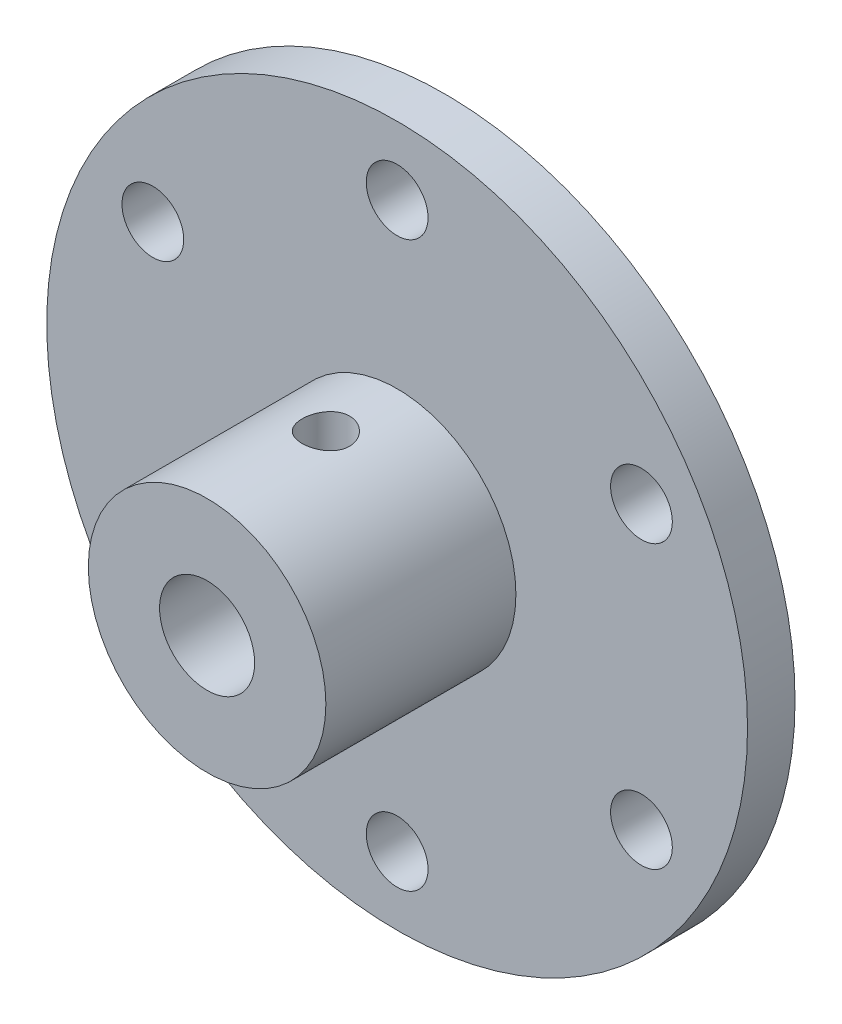
ISO-10303-21;
HEADER;
FILE_DESCRIPTION(('STEP AP214'),'2;1');
FILE_NAME('part.step','',(''),(''),'','','');
FILE_SCHEMA(('AUTOMOTIVE_DESIGN { 1 0 10303 214 1 1 1 1 }'));
ENDSEC;
DATA;
#1=APPLICATION_CONTEXT('core data for automotive mechanical design processes');
#2=APPLICATION_PROTOCOL_DEFINITION('international standard','automotive_design',2000,#1);
#3=PRODUCT_CONTEXT('',#1,'mechanical');
#4=PRODUCT('Part','Part','',(#3));
#5=PRODUCT_RELATED_PRODUCT_CATEGORY('part','',(#4));
#6=PRODUCT_DEFINITION_FORMATION('','',#4);
#7=PRODUCT_DEFINITION_CONTEXT('part definition',#1,'design');
#8=PRODUCT_DEFINITION('design','',#6,#7);
#9=PRODUCT_DEFINITION_SHAPE('','',#8);
#10=(LENGTH_UNIT() NAMED_UNIT(*) SI_UNIT(.MILLI.,.METRE.));
#11=(NAMED_UNIT(*) PLANE_ANGLE_UNIT() SI_UNIT($,.RADIAN.));
#12=(NAMED_UNIT(*) SI_UNIT($,.STERADIAN.) SOLID_ANGLE_UNIT());
#13=UNCERTAINTY_MEASURE_WITH_UNIT(LENGTH_MEASURE(1.E-05),#10,'distance_accuracy_value','');
#14=(GEOMETRIC_REPRESENTATION_CONTEXT(3) GLOBAL_UNCERTAINTY_ASSIGNED_CONTEXT((#13)) GLOBAL_UNIT_ASSIGNED_CONTEXT((#10,
#11,#12)) REPRESENTATION_CONTEXT('',''));
#15=CARTESIAN_POINT('',(0.,0.,0.));
#16=DIRECTION('',(0.,0.,1.));
#17=DIRECTION('',(1.,0.,0.));
#18=AXIS2_PLACEMENT_3D('',#15,#16,#17);
#19=CARTESIAN_POINT('',(0.,0.,4.));
#20=DIRECTION('',(0.,0.,-1.));
#21=DIRECTION('',(-1.,0.,0.));
#22=AXIS2_PLACEMENT_3D('',#19,#20,#21);
#23=CYLINDRICAL_SURFACE('',#22,29.5);
#24=CARTESIAN_POINT('',(0.,0.,4.));
#25=DIRECTION('',(0.,0.,1.));
#26=DIRECTION('',(1.,0.,0.));
#27=AXIS2_PLACEMENT_3D('',#24,#25,#26);
#28=CIRCLE('',#27,29.5);
#29=CARTESIAN_POINT('',(29.5,0.,4.));
#30=VERTEX_POINT('',#29);
#31=EDGE_CURVE('E47',#30,#30,#28,.T.);
#32=ORIENTED_EDGE('',*,*,#31,.F.);
#33=EDGE_LOOP('',(#32));
#34=FACE_BOUND('',#33,.T.);
#35=CARTESIAN_POINT('',(0.,0.,0.));
#36=DIRECTION('',(0.,0.,1.));
#37=DIRECTION('',(1.,0.,0.));
#38=AXIS2_PLACEMENT_3D('',#35,#36,#37);
#39=CIRCLE('',#38,29.5);
#40=CARTESIAN_POINT('',(29.5,0.,0.));
#41=VERTEX_POINT('',#40);
#42=EDGE_CURVE('E52',#41,#41,#39,.T.);
#43=ORIENTED_EDGE('',*,*,#42,.T.);
#44=EDGE_LOOP('',(#43));
#45=FACE_BOUND('',#44,.T.);
#46=ADVANCED_FACE('F35',(#34,#45),#23,.T.);
#47=CARTESIAN_POINT('',(0.,0.,4.));
#48=DIRECTION('',(0.,0.,1.));
#49=DIRECTION('',(1.,0.,0.));
#50=AXIS2_PLACEMENT_3D('',#47,#48,#49);
#51=PLANE('',#50);
#52=CARTESIAN_POINT('',(0.,23.75,4.));
#53=DIRECTION('',(0.,0.,1.));
#54=DIRECTION('',(1.,0.,0.));
#55=AXIS2_PLACEMENT_3D('',#52,#53,#54);
#56=CIRCLE('',#55,2.6);
#57=CARTESIAN_POINT('',(2.6,23.75,4.));
#58=VERTEX_POINT('',#57);
#59=EDGE_CURVE('E289',#58,#58,#56,.T.);
#60=ORIENTED_EDGE('',*,*,#59,.F.);
#61=EDGE_LOOP('',(#60));
#62=FACE_BOUND('',#61,.T.);
#63=CARTESIAN_POINT('',(-20.5681033398799,11.8749999999991,4.));
#64=DIRECTION('',(0.,0.,1.));
#65=DIRECTION('',(1.,0.,0.));
#66=AXIS2_PLACEMENT_3D('',#63,#64,#65);
#67=CIRCLE('',#66,2.60000000000102);
#68=CARTESIAN_POINT('',(-17.9681033398789,11.8749999999991,4.));
#69=VERTEX_POINT('',#68);
#70=EDGE_CURVE('E294',#69,#69,#67,.T.);
#71=ORIENTED_EDGE('',*,*,#70,.F.);
#72=EDGE_LOOP('',(#71));
#73=FACE_BOUND('',#72,.T.);
#74=CARTESIAN_POINT('',(-20.5681033398789,-11.8750000000009,4.));
#75=DIRECTION('',(0.,0.,1.));
#76=DIRECTION('',(1.,0.,0.));
#77=AXIS2_PLACEMENT_3D('',#74,#75,#76);
#78=CIRCLE('',#77,2.60000000000192);
#79=CARTESIAN_POINT('',(-17.968103339877,-11.8750000000009,4.));
#80=VERTEX_POINT('',#79);
#81=EDGE_CURVE('E270',#80,#80,#78,.T.);
#82=ORIENTED_EDGE('',*,*,#81,.F.);
#83=EDGE_LOOP('',(#82));
#84=FACE_BOUND('',#83,.T.);
#85=CARTESIAN_POINT('',(2.01632118847236E-12,-23.75,4.));
#86=DIRECTION('',(0.,0.,1.));
#87=DIRECTION('',(1.,0.,0.));
#88=AXIS2_PLACEMENT_3D('',#85,#86,#87);
#89=CIRCLE('',#88,2.60000000000209);
#90=CARTESIAN_POINT('',(2.6000000000041,-23.75,4.));
#91=VERTEX_POINT('',#90);
#92=EDGE_CURVE('E269',#91,#91,#89,.T.);
#93=ORIENTED_EDGE('',*,*,#92,.F.);
#94=EDGE_LOOP('',(#93));
#95=FACE_BOUND('',#94,.T.);
#96=CARTESIAN_POINT('',(20.5681033398819,-11.8749999999991,4.));
#97=DIRECTION('',(0.,0.,1.));
#98=DIRECTION('',(1.,0.,0.));
#99=AXIS2_PLACEMENT_3D('',#96,#97,#98);
#100=CIRCLE('',#99,2.6000000000013);
#101=CARTESIAN_POINT('',(23.1681033398832,-11.8749999999991,4.));
#102=VERTEX_POINT('',#101);
#103=EDGE_CURVE('E277',#102,#102,#100,.T.);
#104=ORIENTED_EDGE('',*,*,#103,.F.);
#105=EDGE_LOOP('',(#104));
#106=FACE_BOUND('',#105,.T.);
#107=CARTESIAN_POINT('',(20.5681033398809,11.8750000000009,4.));
#108=DIRECTION('',(0.,0.,1.));
#109=DIRECTION('',(1.,0.,0.));
#110=AXIS2_PLACEMENT_3D('',#107,#108,#109);
#111=CIRCLE('',#110,2.60000000000029);
#112=CARTESIAN_POINT('',(23.1681033398812,11.8750000000009,4.));
#113=VERTEX_POINT('',#112);
#114=EDGE_CURVE('E283',#113,#113,#111,.T.);
#115=ORIENTED_EDGE('',*,*,#114,.F.);
#116=EDGE_LOOP('',(#115));
#117=FACE_BOUND('',#116,.T.);
#118=CARTESIAN_POINT('',(0.,0.,4.));
#119=DIRECTION('',(0.,0.,1.));
#120=DIRECTION('',(1.,0.,0.));
#121=AXIS2_PLACEMENT_3D('',#118,#119,#120);
#122=CIRCLE('',#121,10.);
#123=CARTESIAN_POINT('',(10.,0.,4.));
#124=VERTEX_POINT('',#123);
#125=EDGE_CURVE('E10',#124,#124,#122,.T.);
#126=ORIENTED_EDGE('',*,*,#125,.F.);
#127=EDGE_LOOP('',(#126));
#128=FACE_BOUND('',#127,.T.);
#129=ORIENTED_EDGE('',*,*,#31,.T.);
#130=EDGE_LOOP('',(#129));
#131=FACE_BOUND('',#130,.T.);
#132=ADVANCED_FACE('F99',(#62,#73,#84,#95,#106,#117,#128,#131),#51,.T.);
#133=CARTESIAN_POINT('',(0.,0.,0.));
#134=DIRECTION('',(0.,0.,1.));
#135=DIRECTION('',(1.,0.,0.));
#136=AXIS2_PLACEMENT_3D('',#133,#134,#135);
#137=PLANE('',#136);
#138=CARTESIAN_POINT('',(0.,23.75,0.));
#139=DIRECTION('',(0.,0.,1.));
#140=DIRECTION('',(1.,0.,0.));
#141=AXIS2_PLACEMENT_3D('',#138,#139,#140);
#142=CIRCLE('',#141,2.6);
#143=CARTESIAN_POINT('',(2.6,23.75,0.));
#144=VERTEX_POINT('',#143);
#145=EDGE_CURVE('E263',#144,#144,#142,.F.);
#146=ORIENTED_EDGE('',*,*,#145,.F.);
#147=EDGE_LOOP('',(#146));
#148=FACE_BOUND('',#147,.T.);
#149=CARTESIAN_POINT('',(-20.5681033398799,11.8749999999991,0.));
#150=DIRECTION('',(0.,0.,1.));
#151=DIRECTION('',(1.,0.,0.));
#152=AXIS2_PLACEMENT_3D('',#149,#150,#151);
#153=CIRCLE('',#152,2.60000000000102);
#154=CARTESIAN_POINT('',(-17.9681033398789,11.8749999999991,0.));
#155=VERTEX_POINT('',#154);
#156=EDGE_CURVE('E273',#155,#155,#153,.F.);
#157=ORIENTED_EDGE('',*,*,#156,.F.);
#158=EDGE_LOOP('',(#157));
#159=FACE_BOUND('',#158,.T.);
#160=CARTESIAN_POINT('',(-20.5681033398789,-11.8750000000009,0.));
#161=DIRECTION('',(0.,0.,1.));
#162=DIRECTION('',(1.,0.,0.));
#163=AXIS2_PLACEMENT_3D('',#160,#161,#162);
#164=CIRCLE('',#163,2.60000000000192);
#165=CARTESIAN_POINT('',(-17.968103339877,-11.8750000000009,0.));
#166=VERTEX_POINT('',#165);
#167=EDGE_CURVE('E266',#166,#166,#164,.F.);
#168=ORIENTED_EDGE('',*,*,#167,.F.);
#169=EDGE_LOOP('',(#168));
#170=FACE_BOUND('',#169,.T.);
#171=CARTESIAN_POINT('',(2.01632118847236E-12,-23.75,0.));
#172=DIRECTION('',(0.,0.,1.));
#173=DIRECTION('',(1.,0.,0.));
#174=AXIS2_PLACEMENT_3D('',#171,#172,#173);
#175=CIRCLE('',#174,2.60000000000209);
#176=CARTESIAN_POINT('',(2.6000000000041,-23.75,0.));
#177=VERTEX_POINT('',#176);
#178=EDGE_CURVE('E274',#177,#177,#175,.F.);
#179=ORIENTED_EDGE('',*,*,#178,.F.);
#180=EDGE_LOOP('',(#179));
#181=FACE_BOUND('',#180,.T.);
#182=CARTESIAN_POINT('',(20.5681033398819,-11.8749999999991,0.));
#183=DIRECTION('',(0.,0.,1.));
#184=DIRECTION('',(1.,0.,0.));
#185=AXIS2_PLACEMENT_3D('',#182,#183,#184);
#186=CIRCLE('',#185,2.6000000000013);
#187=CARTESIAN_POINT('',(23.1681033398832,-11.8749999999991,0.));
#188=VERTEX_POINT('',#187);
#189=EDGE_CURVE('E280',#188,#188,#186,.F.);
#190=ORIENTED_EDGE('',*,*,#189,.F.);
#191=EDGE_LOOP('',(#190));
#192=FACE_BOUND('',#191,.T.);
#193=CARTESIAN_POINT('',(20.5681033398809,11.8750000000009,0.));
#194=DIRECTION('',(0.,0.,1.));
#195=DIRECTION('',(1.,0.,0.));
#196=AXIS2_PLACEMENT_3D('',#193,#194,#195);
#197=CIRCLE('',#196,2.60000000000029);
#198=CARTESIAN_POINT('',(23.1681033398812,11.8750000000009,0.));
#199=VERTEX_POINT('',#198);
#200=EDGE_CURVE('E286',#199,#199,#197,.F.);
#201=ORIENTED_EDGE('',*,*,#200,.F.);
#202=EDGE_LOOP('',(#201));
#203=FACE_BOUND('',#202,.T.);
#204=CARTESIAN_POINT('',(0.,0.,0.));
#205=DIRECTION('',(0.,0.,1.));
#206=DIRECTION('',(1.,0.,0.));
#207=AXIS2_PLACEMENT_3D('',#204,#205,#206);
#208=CIRCLE('',#207,4.);
#209=CARTESIAN_POINT('',(4.,0.,0.));
#210=VERTEX_POINT('',#209);
#211=EDGE_CURVE('E259',#210,#210,#208,.F.);
#212=ORIENTED_EDGE('',*,*,#211,.F.);
#213=EDGE_LOOP('',(#212));
#214=FACE_BOUND('',#213,.T.);
#215=ORIENTED_EDGE('',*,*,#42,.F.);
#216=EDGE_LOOP('',(#215));
#217=FACE_BOUND('',#216,.T.);
#218=ADVANCED_FACE('F97',(#148,#159,#170,#181,#192,#203,#214,#217),#137,.F.);
#219=CARTESIAN_POINT('',(0.,0.,20.));
#220=DIRECTION('',(0.,0.,-1.));
#221=DIRECTION('',(-1.,0.,0.));
#222=AXIS2_PLACEMENT_3D('',#219,#220,#221);
#223=CYLINDRICAL_SURFACE('',#222,10.);
#224=CARTESIAN_POINT('',(0.,-10.,12.));
#225=CARTESIAN_POINT('',(0.111153813585266,-9.99999795161742,11.9999959110033));
#226=CARTESIAN_POINT('',(0.222359320403044,-9.99812770356462,11.9907023140647));
#227=CARTESIAN_POINT('',(0.441627015378038,-9.99084731246463,11.9538029997695));
#228=CARTESIAN_POINT('',(0.549686635082711,-9.98543435720372,11.926182734397));
#229=CARTESIAN_POINT('',(0.759460610526625,-9.97167298556573,11.8535174527584));
#230=CARTESIAN_POINT('',(0.861180935866268,-9.96332738153436,11.8084891263106));
#231=CARTESIAN_POINT('',(1.05561597772845,-9.94460796070629,11.7023355049774));
#232=CARTESIAN_POINT('',(1.14833123015162,-9.93423426471414,11.6412111687856));
#233=CARTESIAN_POINT('',(1.32338695462973,-9.9124433065994,11.5037230114171));
#234=CARTESIAN_POINT('',(1.40558790231705,-9.90101491008695,11.4271832892176));
#235=CARTESIAN_POINT('',(1.55607351321605,-9.87848360905177,11.2614151672166));
#236=CARTESIAN_POINT('',(1.62435708954085,-9.86738073000848,11.1721857773298));
#237=CARTESIAN_POINT('',(1.74566350669524,-9.8466488362523,10.9825676139763));
#238=CARTESIAN_POINT('',(1.79854187773173,-9.83703414729892,10.8820847124073));
#239=CARTESIAN_POINT('',(1.88661133316062,-9.82052536116836,10.6734363619918));
#240=CARTESIAN_POINT('',(1.92180416487448,-9.81363099523923,10.5652716733073));
#241=CARTESIAN_POINT('',(1.97305059976965,-9.80345610504409,10.3458312721842));
#242=CARTESIAN_POINT('',(1.98934899591755,-9.80012940214375,10.2346149117155));
#243=CARTESIAN_POINT('',(2.00310425545224,-9.79732750121254,10.0109803572713));
#244=CARTESIAN_POINT('',(2.000563045427,-9.79785190935681,9.89856228735971));
#245=CARTESIAN_POINT('',(1.97690914620364,-9.80265102296369,9.67750642395799));
#246=CARTESIAN_POINT('',(1.95607708048781,-9.80686905717527,9.56883718874537));
#247=CARTESIAN_POINT('',(1.8968757692461,-9.81849092320002,9.35656784667399));
#248=CARTESIAN_POINT('',(1.85850568620136,-9.82589490715558,9.25296798216198));
#249=CARTESIAN_POINT('',(1.76504956734944,-9.84311237000816,9.0529694765928));
#250=CARTESIAN_POINT('',(1.70985230246423,-9.85294179627409,8.95662424086166));
#251=CARTESIAN_POINT('',(1.58438714914536,-9.87389237546124,8.77445830005437));
#252=CARTESIAN_POINT('',(1.51411752871366,-9.88501367676732,8.68863880629769));
#253=CARTESIAN_POINT('',(1.35899986912117,-9.90754042482924,8.52834119508613));
#254=CARTESIAN_POINT('',(1.27391232242489,-9.9189473842181,8.45409486428174));
#255=CARTESIAN_POINT('',(1.09237004812402,-9.94057697428817,8.32089230739755));
#256=CARTESIAN_POINT('',(0.995915174758779,-9.95079958977947,8.26193627741284));
#257=CARTESIAN_POINT('',(0.794118773757842,-9.96893380321774,8.16094498154805));
#258=CARTESIAN_POINT('',(0.6887636391706,-9.97684177696544,8.11893621271093));
#259=CARTESIAN_POINT('',(0.47229795289733,-9.98942817975716,8.05327905192287));
#260=CARTESIAN_POINT('',(0.361188100144899,-9.99410700001063,8.02962843585274));
#261=CARTESIAN_POINT('',(0.138358811254301,-9.99965343733735,8.00168709241145));
#262=CARTESIAN_POINT('',(0.0266806566511524,-10.0005834930494,7.99707916091946));
#263=CARTESIAN_POINT('',(-0.195849868385428,-9.99870103860205,8.00649971788436));
#264=CARTESIAN_POINT('',(-0.306702284887586,-9.99588873882892,8.02052715870519));
#265=CARTESIAN_POINT('',(-0.523411319893082,-9.98687664016035,8.06655674708791));
#266=CARTESIAN_POINT('',(-0.629303896679806,-9.98070752808413,8.09839613699581));
#267=CARTESIAN_POINT('',(-0.834247254999334,-9.96567104122065,8.17896796531162));
#268=CARTESIAN_POINT('',(-0.933297523275079,-9.95680346428454,8.22770166935366));
#269=CARTESIAN_POINT('',(-1.12308234737243,-9.93719823066589,8.34136498130263));
#270=CARTESIAN_POINT('',(-1.21370025350437,-9.92643900874103,8.40648556207789));
#271=CARTESIAN_POINT('',(-1.38283603823841,-9.90429469659765,8.55081838241456));
#272=CARTESIAN_POINT('',(-1.46135261786152,-9.89290953936776,8.63003213279973));
#273=CARTESIAN_POINT('',(-1.60528118154835,-9.8705860711393,8.80174670378225));
#274=CARTESIAN_POINT('',(-1.67047540489731,-9.85965720466609,8.89443148844267));
#275=CARTESIAN_POINT('',(-1.78437084010241,-9.83968383592389,9.08962272271336));
#276=CARTESIAN_POINT('',(-1.8330727118458,-9.83063925826685,9.1921287791471));
#277=CARTESIAN_POINT('',(-1.91230368316392,-9.81553481168766,9.4035364922991));
#278=CARTESIAN_POINT('',(-1.9429269995821,-9.80945949744373,9.51240168242064));
#279=CARTESIAN_POINT('',(-1.98541730325439,-9.8009487358405,9.73386690698181));
#280=CARTESIAN_POINT('',(-1.99728673645022,-9.79851281382223,9.84646645241869));
#281=CARTESIAN_POINT('',(-2.00184182173494,-9.79758299262758,10.0700177290886));
#282=CARTESIAN_POINT('',(-1.99487157614179,-9.79901838378602,10.180962297854));
#283=CARTESIAN_POINT('',(-1.96270460820012,-9.80551146969228,10.4000632998101));
#284=CARTESIAN_POINT('',(-1.9375080322586,-9.81056913534338,10.5082197553896));
#285=CARTESIAN_POINT('',(-1.86975713699791,-9.82370528438317,10.7184554224811));
#286=CARTESIAN_POINT('',(-1.82724501343469,-9.83177642037661,10.8205487210048));
#287=CARTESIAN_POINT('',(-1.72610928920321,-9.85003429948341,11.0162074414689));
#288=CARTESIAN_POINT('',(-1.66748433754976,-9.86022121997788,11.1097721474503));
#289=CARTESIAN_POINT('',(-1.53461182957283,-9.88177921046451,11.2874311443006));
#290=CARTESIAN_POINT('',(-1.46011577447036,-9.89316745819399,11.3713375305352));
#291=CARTESIAN_POINT('',(-1.29812873802628,-9.91572163743909,11.5255724110583));
#292=CARTESIAN_POINT('',(-1.21063477430667,-9.92688751726369,11.5958977806345));
#293=CARTESIAN_POINT('',(-1.02403525817649,-9.94787664775943,11.7216692878929));
#294=CARTESIAN_POINT('',(-0.924817768859669,-9.95768462438492,11.77695200656));
#295=CARTESIAN_POINT('',(-0.718332721881464,-9.9747025017,11.8699722451932));
#296=CARTESIAN_POINT('',(-0.611072521726252,-9.98191474277232,11.907725579065));
#297=CARTESIAN_POINT('',(-0.419642977847558,-9.99152745190741,11.9573038960894));
#298=CARTESIAN_POINT('',(-0.336563328027569,-9.99468606316904,11.9732863874155));
#299=CARTESIAN_POINT('',(-0.168999050420134,-9.99892308279786,11.9946358247167));
#300=CARTESIAN_POINT('',(-0.084514467497238,-10.0000015574631,12.0000031090195));
#301=CARTESIAN_POINT('',(0.,-10.,12.));
#302=B_SPLINE_CURVE_WITH_KNOTS('',3,(#224,#225,#226,#227,#228,#229,#230,#231,#232,#233,#234,
#235,#236,#237,#238,#239,#240,#241,#242,#243,#244,#245,#246,#247,#248,#249,#250,#251,#252,#253,
#254,#255,#256,#257,#258,#259,#260,#261,#262,#263,#264,#265,#266,#267,#268,#269,#270,#271,#272,
#273,#274,#275,#276,#277,#278,#279,#280,#281,#282,#283,#284,#285,#286,#287,#288,#289,#290,#291,
#292,#293,#294,#295,#296,#297,#298,#299,#300,#301),.UNSPECIFIED.,.T.,.F.,(4,2,2,2,2,2,2,2,2,2,2,
2,2,2,2,2,2,2,2,2,2,2,2,2,2,2,2,2,2,2,2,2,2,2,2,2,2,2,4),(0.,0.333152261322517,
0.666569301382645,0.999667470500682,1.33274580446172,1.66986534022437,2.00701119349473,
2.34722390011845,2.68740298730395,3.02312370207175,3.3588100856245,3.68943454012557,
4.02007478507459,4.35294980407185,4.68586309499341,5.02476504982701,5.3636713507964,
5.70310549708048,6.04249851396072,6.3762147135253,6.70991215315735,7.04060907901447,
7.37133078432045,7.70610132066717,8.0409077669186,8.38081257158451,8.72070377446933,
9.05880762065446,9.39686736660829,9.72879445135403,10.0607188698522,10.3918392250622,
10.7229873516373,11.0597615247829,11.3966130906586,11.7369899335127,12.0770591103504,
12.3303755057979,12.5836838274199),.UNSPECIFIED.);
#303=CARTESIAN_POINT('',(0.,-10.,12.));
#304=VERTEX_POINT('',#303);
#305=EDGE_CURVE('E87',#304,#304,#302,.T.);
#306=ORIENTED_EDGE('',*,*,#305,.T.);
#307=EDGE_LOOP('',(#306));
#308=FACE_BOUND('',#307,.T.);
#309=CARTESIAN_POINT('',(0.,10.,12.));
#310=CARTESIAN_POINT('',(-0.111153813585267,9.99999795161742,11.9999959110033));
#311=CARTESIAN_POINT('',(-0.222359320403045,9.99812770356462,11.9907023140647));
#312=CARTESIAN_POINT('',(-0.441627015378039,9.99084731246463,11.9538029997695));
#313=CARTESIAN_POINT('',(-0.549686635082712,9.98543435720372,11.926182734397));
#314=CARTESIAN_POINT('',(-0.759460610526626,9.97167298556573,11.8535174527584));
#315=CARTESIAN_POINT('',(-0.861180935866269,9.96332738153436,11.8084891263106));
#316=CARTESIAN_POINT('',(-1.05561597772845,9.94460796070629,11.7023355049774));
#317=CARTESIAN_POINT('',(-1.14833123015162,9.93423426471414,11.6412111687856));
#318=CARTESIAN_POINT('',(-1.32338695462973,9.9124433065994,11.5037230114171));
#319=CARTESIAN_POINT('',(-1.40558790231705,9.90101491008695,11.4271832892176));
#320=CARTESIAN_POINT('',(-1.55607351321606,9.87848360905177,11.2614151672166));
#321=CARTESIAN_POINT('',(-1.62435708954085,9.86738073000848,11.1721857773298));
#322=CARTESIAN_POINT('',(-1.74566350669524,9.8466488362523,10.9825676139762));
#323=CARTESIAN_POINT('',(-1.79854187773173,9.83703414729892,10.8820847124073));
#324=CARTESIAN_POINT('',(-1.88661133316062,9.82052536116836,10.6734363619918));
#325=CARTESIAN_POINT('',(-1.92180416487448,9.81363099523923,10.5652716733073));
#326=CARTESIAN_POINT('',(-1.97305059976965,9.80345610504409,10.3458312721842));
#327=CARTESIAN_POINT('',(-1.98934899591755,9.80012940214375,10.2346149117155));
#328=CARTESIAN_POINT('',(-2.00310425545224,9.79732750121254,10.0109803572713));
#329=CARTESIAN_POINT('',(-2.000563045427,9.79785190935681,9.89856228735971));
#330=CARTESIAN_POINT('',(-1.97690914620364,9.80265102296369,9.67750642395799));
#331=CARTESIAN_POINT('',(-1.95607708048781,9.80686905717527,9.56883718874537));
#332=CARTESIAN_POINT('',(-1.8968757692461,9.81849092320002,9.35656784667399));
#333=CARTESIAN_POINT('',(-1.85850568620136,9.82589490715558,9.25296798216198));
#334=CARTESIAN_POINT('',(-1.76504956734944,9.84311237000816,9.0529694765928));
#335=CARTESIAN_POINT('',(-1.70985230246423,9.85294179627409,8.95662424086166));
#336=CARTESIAN_POINT('',(-1.58438714914536,9.87389237546124,8.77445830005437));
#337=CARTESIAN_POINT('',(-1.51411752871366,9.88501367676732,8.68863880629769));
#338=CARTESIAN_POINT('',(-1.35899986912117,9.90754042482924,8.52834119508613));
#339=CARTESIAN_POINT('',(-1.27391232242489,9.9189473842181,8.45409486428174));
#340=CARTESIAN_POINT('',(-1.09237004812402,9.94057697428817,8.32089230739755));
#341=CARTESIAN_POINT('',(-0.995915174758779,9.95079958977947,8.26193627741284));
#342=CARTESIAN_POINT('',(-0.794118773757842,9.96893380321774,8.16094498154805));
#343=CARTESIAN_POINT('',(-0.6887636391706,9.97684177696544,8.11893621271093));
#344=CARTESIAN_POINT('',(-0.47229795289733,9.98942817975716,8.05327905192287));
#345=CARTESIAN_POINT('',(-0.3611881001449,9.99410700001063,8.02962843585274));
#346=CARTESIAN_POINT('',(-0.138358811254302,9.99965343733735,8.00168709241145));
#347=CARTESIAN_POINT('',(-0.0266806566511531,10.0005834930494,7.99707916091946));
#348=CARTESIAN_POINT('',(0.195849868385428,9.99870103860205,8.00649971788436));
#349=CARTESIAN_POINT('',(0.306702284887586,9.99588873882892,8.02052715870519));
#350=CARTESIAN_POINT('',(0.523411319893082,9.98687664016035,8.06655674708791));
#351=CARTESIAN_POINT('',(0.629303896679807,9.98070752808413,8.09839613699581));
#352=CARTESIAN_POINT('',(0.834247254999335,9.96567104122065,8.17896796531162));
#353=CARTESIAN_POINT('',(0.93329752327508,9.95680346428453,8.22770166935366));
#354=CARTESIAN_POINT('',(1.12308234737244,9.93719823066589,8.34136498130263));
#355=CARTESIAN_POINT('',(1.21370025350438,9.92643900874103,8.40648556207789));
#356=CARTESIAN_POINT('',(1.38283603823841,9.90429469659765,8.55081838241456));
#357=CARTESIAN_POINT('',(1.46135261786153,9.89290953936776,8.63003213279973));
#358=CARTESIAN_POINT('',(1.60528118154835,9.8705860711393,8.80174670378225));
#359=CARTESIAN_POINT('',(1.67047540489731,9.85965720466609,8.89443148844267));
#360=CARTESIAN_POINT('',(1.78437084010241,9.83968383592389,9.08962272271336));
#361=CARTESIAN_POINT('',(1.83307271184581,9.83063925826685,9.1921287791471));
#362=CARTESIAN_POINT('',(1.91230368316392,9.81553481168766,9.4035364922991));
#363=CARTESIAN_POINT('',(1.9429269995821,9.80945949744373,9.51240168242064));
#364=CARTESIAN_POINT('',(1.98541730325439,9.8009487358405,9.73386690698181));
#365=CARTESIAN_POINT('',(1.99728673645023,9.79851281382223,9.8464664524187));
#366=CARTESIAN_POINT('',(2.00184182173494,9.79758299262758,10.0700177290886));
#367=CARTESIAN_POINT('',(1.99487157614179,9.79901838378602,10.180962297854));
#368=CARTESIAN_POINT('',(1.96270460820012,9.80551146969228,10.4000632998101));
#369=CARTESIAN_POINT('',(1.9375080322586,9.81056913534338,10.5082197553896));
#370=CARTESIAN_POINT('',(1.86975713699791,9.82370528438317,10.7184554224811));
#371=CARTESIAN_POINT('',(1.82724501343469,9.83177642037661,10.8205487210048));
#372=CARTESIAN_POINT('',(1.72610928920321,9.85003429948341,11.0162074414689));
#373=CARTESIAN_POINT('',(1.66748433754976,9.86022121997788,11.1097721474503));
#374=CARTESIAN_POINT('',(1.53461182957283,9.88177921046451,11.2874311443006));
#375=CARTESIAN_POINT('',(1.46011577447036,9.89316745819399,11.3713375305352));
#376=CARTESIAN_POINT('',(1.29812873802628,9.91572163743909,11.5255724110583));
#377=CARTESIAN_POINT('',(1.21063477430667,9.92688751726369,11.5958977806345));
#378=CARTESIAN_POINT('',(1.02403525817649,9.94787664775943,11.7216692878929));
#379=CARTESIAN_POINT('',(0.92481776885967,9.95768462438492,11.77695200656));
#380=CARTESIAN_POINT('',(0.718332721881466,9.9747025017,11.8699722451932));
#381=CARTESIAN_POINT('',(0.611072521726253,9.98191474277232,11.907725579065));
#382=CARTESIAN_POINT('',(0.419642977847559,9.99152745190741,11.9573038960894));
#383=CARTESIAN_POINT('',(0.336563328027569,9.99468606316904,11.9732863874155));
#384=CARTESIAN_POINT('',(0.168999050420133,9.99892308279786,11.9946358247167));
#385=CARTESIAN_POINT('',(0.0845144674972378,10.0000015574631,12.0000031090195));
#386=CARTESIAN_POINT('',(0.,10.,12.));
#387=B_SPLINE_CURVE_WITH_KNOTS('',3,(#309,#310,#311,#312,#313,#314,#315,#316,#317,#318,#319,
#320,#321,#322,#323,#324,#325,#326,#327,#328,#329,#330,#331,#332,#333,#334,#335,#336,#337,#338,
#339,#340,#341,#342,#343,#344,#345,#346,#347,#348,#349,#350,#351,#352,#353,#354,#355,#356,#357,
#358,#359,#360,#361,#362,#363,#364,#365,#366,#367,#368,#369,#370,#371,#372,#373,#374,#375,#376,
#377,#378,#379,#380,#381,#382,#383,#384,#385,#386),.UNSPECIFIED.,.T.,.F.,(4,2,2,2,2,2,2,2,2,2,2,
2,2,2,2,2,2,2,2,2,2,2,2,2,2,2,2,2,2,2,2,2,2,2,2,2,2,2,4),(0.,0.333152261322517,
0.666569301382646,0.999667470500684,1.33274580446173,1.66986534022437,2.00701119349473,
2.34722390011846,2.68740298730395,3.02312370207175,3.3588100856245,3.68943454012557,
4.02007478507459,4.35294980407185,4.68586309499341,5.02476504982701,5.3636713507964,
5.70310549708048,6.04249851396072,6.3762147135253,6.70991215315735,7.04060907901447,
7.37133078432045,7.70610132066717,8.0409077669186,8.38081257158451,8.72070377446933,
9.05880762065446,9.39686736660829,9.72879445135403,10.0607188698522,10.3918392250622,
10.7229873516373,11.0597615247829,11.3966130906586,11.7369899335127,12.0770591103504,
12.3303755057979,12.5836838274199),.UNSPECIFIED.);
#388=CARTESIAN_POINT('',(0.,10.,12.));
#389=VERTEX_POINT('',#388);
#390=EDGE_CURVE('E81',#389,#389,#387,.T.);
#391=ORIENTED_EDGE('',*,*,#390,.T.);
#392=EDGE_LOOP('',(#391));
#393=FACE_BOUND('',#392,.T.);
#394=CARTESIAN_POINT('',(0.,0.,20.));
#395=DIRECTION('',(0.,0.,1.));
#396=DIRECTION('',(1.,0.,0.));
#397=AXIS2_PLACEMENT_3D('',#394,#395,#396);
#398=CIRCLE('',#397,10.);
#399=CARTESIAN_POINT('',(10.,0.,20.));
#400=VERTEX_POINT('',#399);
#401=EDGE_CURVE('E55',#400,#400,#398,.T.);
#402=ORIENTED_EDGE('',*,*,#401,.F.);
#403=EDGE_LOOP('',(#402));
#404=FACE_BOUND('',#403,.T.);
#405=ORIENTED_EDGE('',*,*,#125,.T.);
#406=EDGE_LOOP('',(#405));
#407=FACE_BOUND('',#406,.T.);
#408=ADVANCED_FACE('F92',(#308,#393,#404,#407),#223,.T.);
#409=CARTESIAN_POINT('',(0.,0.,20.));
#410=DIRECTION('',(0.,0.,1.));
#411=DIRECTION('',(1.,0.,0.));
#412=AXIS2_PLACEMENT_3D('',#409,#410,#411);
#413=PLANE('',#412);
#414=CARTESIAN_POINT('',(0.,0.,20.));
#415=DIRECTION('',(0.,0.,1.));
#416=DIRECTION('',(1.,0.,0.));
#417=AXIS2_PLACEMENT_3D('',#414,#415,#416);
#418=CIRCLE('',#417,4.);
#419=CARTESIAN_POINT('',(4.,0.,20.));
#420=VERTEX_POINT('',#419);
#421=EDGE_CURVE('E255',#420,#420,#418,.T.);
#422=ORIENTED_EDGE('',*,*,#421,.F.);
#423=EDGE_LOOP('',(#422));
#424=FACE_BOUND('',#423,.T.);
#425=ORIENTED_EDGE('',*,*,#401,.T.);
#426=EDGE_LOOP('',(#425));
#427=FACE_BOUND('',#426,.T.);
#428=ADVANCED_FACE('F96',(#424,#427),#413,.T.);
#429=CARTESIAN_POINT('',(0.,0.,-11.3137084989848));
#430=DIRECTION('',(0.,0.,1.));
#431=DIRECTION('',(1.,0.,0.));
#432=AXIS2_PLACEMENT_3D('',#429,#430,#431);
#433=CYLINDRICAL_SURFACE('',#432,4.);
#434=CARTESIAN_POINT('',(0.,-4.,12.));
#435=CARTESIAN_POINT('',(-0.105143925902467,-3.99999426810082,11.9999933953656));
#436=CARTESIAN_POINT('',(-0.210413199395125,-3.99580982039513,11.9916598537579));
#437=CARTESIAN_POINT('',(-0.417840470537792,-3.97948312074314,11.9586942393169));
#438=CARTESIAN_POINT('',(-0.519992173427258,-3.96732575657839,11.9340312140044));
#439=CARTESIAN_POINT('',(-0.717867089760897,-3.93632558806751,11.8696123827667));
#440=CARTESIAN_POINT('',(-0.813613605878292,-3.91750878355075,11.8299152315041));
#441=CARTESIAN_POINT('',(-0.996945233613196,-3.87491553031523,11.73685875727));
#442=CARTESIAN_POINT('',(-1.08453098798012,-3.85113947267051,11.6835005115023));
#443=CARTESIAN_POINT('',(-1.25501563552382,-3.79912516516124,11.5609655010294));
#444=CARTESIAN_POINT('',(-1.33731042224422,-3.77070398255074,11.4910270415207));
#445=CARTESIAN_POINT('',(-1.48955888973396,-3.71319940493486,11.3389570415059));
#446=CARTESIAN_POINT('',(-1.55950316621353,-3.68411552418069,11.2568162964551));
#447=CARTESIAN_POINT('',(-1.69050400090055,-3.62597902394695,11.0750333009532));
#448=CARTESIAN_POINT('',(-1.75045067110327,-3.59710373940264,10.9745278033082));
#449=CARTESIAN_POINT('',(-1.85233645378139,-3.54571957544641,10.7632653280276));
#450=CARTESIAN_POINT('',(-1.89428842993267,-3.52320615213979,10.6525157425545));
#451=CARTESIAN_POINT('',(-1.95626488437718,-3.48915734075617,10.4306697891562));
#452=CARTESIAN_POINT('',(-1.97745171416088,-3.47704543167427,10.3199910958652));
#453=CARTESIAN_POINT('',(-2.00085398661769,-3.46363779897055,10.096042324441));
#454=CARTESIAN_POINT('',(-2.00308817674615,-3.46233138686576,9.98277491825769));
#455=CARTESIAN_POINT('',(-1.98937457434459,-3.47021860514497,9.77142795136926));
#456=CARTESIAN_POINT('',(-1.97556911907364,-3.47817527324027,9.6731519375539));
#457=CARTESIAN_POINT('',(-1.93387969811386,-3.501524574677,9.48055618125392));
#458=CARTESIAN_POINT('',(-1.9059912477953,-3.51691957663553,9.38623770938937));
#459=CARTESIAN_POINT('',(-1.83641956077201,-3.55374952825482,9.20154173486868));
#460=CARTESIAN_POINT('',(-1.79443013423199,-3.57531681327997,9.11130720242842));
#461=CARTESIAN_POINT('',(-1.698083375336,-3.62206808562807,8.93873141481998));
#462=CARTESIAN_POINT('',(-1.64372048762493,-3.64725369560381,8.85639372879982));
#463=CARTESIAN_POINT('',(-1.51613210982558,-3.70226315806572,8.69095749451355));
#464=CARTESIAN_POINT('',(-1.44138891673856,-3.73227020473492,8.60908625284768));
#465=CARTESIAN_POINT('',(-1.27911115748275,-3.79095246600814,8.45852916281819));
#466=CARTESIAN_POINT('',(-1.19157051314857,-3.81962703917602,8.38984961593223));
#467=CARTESIAN_POINT('',(-1.0010330116637,-3.87403974565928,8.26462867794054));
#468=CARTESIAN_POINT('',(-0.897507183198817,-3.89957968324015,8.20879905510852));
#469=CARTESIAN_POINT('',(-0.680932430977593,-3.94315762242485,8.11580594191398));
#470=CARTESIAN_POINT('',(-0.567891152530551,-3.96120157887106,8.07862762996967));
#471=CARTESIAN_POINT('',(-0.345532983321404,-3.98648667482871,8.02704919256665));
#472=CARTESIAN_POINT('',(-0.236683061096652,-3.9944987660262,8.01101752850644));
#473=CARTESIAN_POINT('',(-0.0175591998987035,-4.00146026918207,7.99707053773102));
#474=CARTESIAN_POINT('',(0.0927140397398171,-4.00041397442637,7.99914662872106));
#475=CARTESIAN_POINT('',(0.302465943971973,-3.9898238450687,8.02041337683749));
#476=CARTESIAN_POINT('',(0.40211881609986,-3.98094491376337,8.03826506545999));
#477=CARTESIAN_POINT('',(0.596813784603881,-3.95644342629681,8.08847614379024));
#478=CARTESIAN_POINT('',(0.691855371382173,-3.94082012668824,8.12083713290699));
#479=CARTESIAN_POINT('',(0.877777216899144,-3.90368502827176,8.19999693286607));
#480=CARTESIAN_POINT('',(0.968460794011606,-3.88201763539262,8.24718210023257));
#481=CARTESIAN_POINT('',(1.14092272339854,-3.83487948634835,8.35421507129313));
#482=CARTESIAN_POINT('',(1.22269725955318,-3.80940711133877,8.41406826919079));
#483=CARTESIAN_POINT('',(1.38353537857843,-3.75416442672396,8.55152085066143));
#484=CARTESIAN_POINT('',(1.46154415563805,-3.72421769686998,8.63028573689029));
#485=CARTESIAN_POINT('',(1.60371264223771,-3.6652478321764,8.79985030255545));
#486=CARTESIAN_POINT('',(1.66786277142374,-3.63622534800094,8.89065823769584));
#487=CARTESIAN_POINT('',(1.78341582895803,-3.58102384412979,9.08728730834595));
#488=CARTESIAN_POINT('',(1.83405099160049,-3.55505059178121,9.19362253218896));
#489=CARTESIAN_POINT('',(1.91616565186941,-3.51148144588269,9.41502013514993));
#490=CARTESIAN_POINT('',(1.94766983173403,-3.493874764435,9.53007105293378));
#491=CARTESIAN_POINT('',(1.98772337493374,-3.47123002051604,9.75382044576941));
#492=CARTESIAN_POINT('',(1.9981859928109,-3.4651476693013,9.86206850687048));
#493=CARTESIAN_POINT('',(2.0013783087524,-3.46330709283206,10.078894134329));
#494=CARTESIAN_POINT('',(1.99411569324648,-3.4675443925278,10.1874715374757));
#495=CARTESIAN_POINT('',(1.96385225118662,-3.48475724102153,10.3909670030669));
#496=CARTESIAN_POINT('',(1.94241662868607,-3.49686188965317,10.4862009402895));
#497=CARTESIAN_POINT('',(1.88635071644882,-3.52742032375305,10.6716162388487));
#498=CARTESIAN_POINT('',(1.85171618231984,-3.54587615139337,10.7617959641841));
#499=CARTESIAN_POINT('',(1.76763149060113,-3.58857060729071,10.9412497019731));
#500=CARTESIAN_POINT('',(1.7173422756314,-3.61311444791841,11.0300558036581));
#501=CARTESIAN_POINT('',(1.60430194327478,-3.66470663269721,11.1985490723625));
#502=CARTESIAN_POINT('',(1.54154434248312,-3.69175627591221,11.2782314610422));
#503=CARTESIAN_POINT('',(1.39640665332275,-3.74924646316184,11.4362839647094));
#504=CARTESIAN_POINT('',(1.31256884599452,-3.77969966613256,11.5133182047006));
#505=CARTESIAN_POINT('',(1.13230961246639,-3.83755504519861,11.6525259668705));
#506=CARTESIAN_POINT('',(1.03588144661039,-3.8649555725239,11.7146914789398));
#507=CARTESIAN_POINT('',(0.83186319356589,-3.91396019133075,11.8224727254241));
#508=CARTESIAN_POINT('',(0.72419900755346,-3.93552192987866,11.8679683384729));
#509=CARTESIAN_POINT('',(0.501484202276172,-3.97002682597974,11.9396163355148));
#510=CARTESIAN_POINT('',(0.386455599178198,-3.98299446726136,11.9658236936114));
#511=CARTESIAN_POINT('',(0.225203892981788,-3.99390923826956,11.9877948221715));
#512=CARTESIAN_POINT('',(0.180323758883128,-3.99618730680502,11.9923652817327));
#513=CARTESIAN_POINT('',(0.0903034636101818,-3.99923393953631,11.9984693310282));
#514=CARTESIAN_POINT('',(0.0451632952932562,-4.00000246206762,12.0000028369404));
#515=CARTESIAN_POINT('',(0.,-4.,12.));
#516=B_SPLINE_CURVE_WITH_KNOTS('',3,(#434,#435,#436,#437,#438,#439,#440,#441,#442,#443,#444,
#445,#446,#447,#448,#449,#450,#451,#452,#453,#454,#455,#456,#457,#458,#459,#460,#461,#462,#463,
#464,#465,#466,#467,#468,#469,#470,#471,#472,#473,#474,#475,#476,#477,#478,#479,#480,#481,#482,
#483,#484,#485,#486,#487,#488,#489,#490,#491,#492,#493,#494,#495,#496,#497,#498,#499,#500,#501,
#502,#503,#504,#505,#506,#507,#508,#509,#510,#511,#512,#513,#514,#515),.UNSPECIFIED.,.T.,.F.,(4,
2,2,2,2,2,2,2,2,2,2,2,2,2,2,2,2,2,2,2,2,2,2,2,2,2,2,2,2,2,2,2,2,2,2,2,2,2,2,2,4),(0.,
0.315248514840585,0.631096299418395,0.945724310984596,1.26032752116313,1.59396351743618,
1.92785247530807,2.28763452861505,2.64715895796562,2.98516024280459,3.32282714658041,
3.62011424818641,3.91749607851357,4.22180480336975,4.52625042520444,4.86929882667757,
5.21251069197373,5.57166044428881,5.93052433824559,6.25966580942691,6.58865129022952,
6.89213813012244,7.19565843261863,7.50785712055797,7.82018901496678,8.16319221288837,
8.50643177230863,8.86629364323451,9.22569023890901,9.55058615006093,9.87534119729357,
10.1691586049771,10.463070575767,10.7767291356057,11.0905512228726,11.4425048551434,
11.7946476676249,12.1492802732705,12.502898172423,12.6383056026783,12.7737167702213),.UNSPECIFIED.);
#517=CARTESIAN_POINT('',(0.,-4.,12.));
#518=VERTEX_POINT('',#517);
#519=EDGE_CURVE('E38',#518,#518,#516,.T.);
#520=ORIENTED_EDGE('',*,*,#519,.T.);
#521=EDGE_LOOP('',(#520));
#522=FACE_BOUND('',#521,.T.);
#523=CARTESIAN_POINT('',(0.,4.,12.));
#524=CARTESIAN_POINT('',(0.105143925902467,3.99999426810082,11.9999933953656));
#525=CARTESIAN_POINT('',(0.210413199395125,3.99580982039513,11.9916598537579));
#526=CARTESIAN_POINT('',(0.417840470537793,3.97948312074314,11.9586942393169));
#527=CARTESIAN_POINT('',(0.51999217342726,3.96732575657839,11.9340312140044));
#528=CARTESIAN_POINT('',(0.717867089760899,3.93632558806751,11.8696123827667));
#529=CARTESIAN_POINT('',(0.813613605878295,3.91750878355075,11.8299152315041));
#530=CARTESIAN_POINT('',(0.9969452336132,3.87491553031523,11.73685875727));
#531=CARTESIAN_POINT('',(1.08453098798012,3.8511394726705,11.6835005115023));
#532=CARTESIAN_POINT('',(1.25501563552382,3.79912516516124,11.5609655010294));
#533=CARTESIAN_POINT('',(1.33731042224422,3.77070398255074,11.4910270415207));
#534=CARTESIAN_POINT('',(1.48955888973396,3.71319940493486,11.3389570415059));
#535=CARTESIAN_POINT('',(1.55950316621354,3.68411552418069,11.2568162964551));
#536=CARTESIAN_POINT('',(1.69050400090056,3.62597902394695,11.0750333009532));
#537=CARTESIAN_POINT('',(1.75045067110328,3.59710373940264,10.9745278033082));
#538=CARTESIAN_POINT('',(1.85233645378139,3.54571957544641,10.7632653280276));
#539=CARTESIAN_POINT('',(1.89428842993267,3.52320615213979,10.6525157425545));
#540=CARTESIAN_POINT('',(1.95626488437718,3.48915734075617,10.4306697891562));
#541=CARTESIAN_POINT('',(1.97745171416088,3.47704543167427,10.3199910958652));
#542=CARTESIAN_POINT('',(2.00085398661769,3.46363779897055,10.096042324441));
#543=CARTESIAN_POINT('',(2.00308817674615,3.46233138686576,9.98277491825768));
#544=CARTESIAN_POINT('',(1.98937457434459,3.47021860514497,9.77142795136926));
#545=CARTESIAN_POINT('',(1.97556911907364,3.47817527324027,9.6731519375539));
#546=CARTESIAN_POINT('',(1.93387969811386,3.50152457467701,9.48055618125391));
#547=CARTESIAN_POINT('',(1.9059912477953,3.51691957663553,9.38623770938937));
#548=CARTESIAN_POINT('',(1.83641956077201,3.55374952825482,9.20154173486868));
#549=CARTESIAN_POINT('',(1.79443013423199,3.57531681327997,9.11130720242842));
#550=CARTESIAN_POINT('',(1.698083375336,3.62206808562807,8.93873141481998));
#551=CARTESIAN_POINT('',(1.64372048762493,3.64725369560381,8.85639372879982));
#552=CARTESIAN_POINT('',(1.51613210982558,3.70226315806572,8.69095749451355));
#553=CARTESIAN_POINT('',(1.44138891673856,3.73227020473492,8.60908625284769));
#554=CARTESIAN_POINT('',(1.27911115748275,3.79095246600814,8.4585291628182));
#555=CARTESIAN_POINT('',(1.19157051314857,3.81962703917602,8.38984961593224));
#556=CARTESIAN_POINT('',(1.0010330116637,3.87403974565928,8.26462867794055));
#557=CARTESIAN_POINT('',(0.897507183198819,3.89957968324014,8.20879905510852));
#558=CARTESIAN_POINT('',(0.680932430977595,3.94315762242485,8.11580594191398));
#559=CARTESIAN_POINT('',(0.567891152530554,3.96120157887106,8.07862762996967));
#560=CARTESIAN_POINT('',(0.345532983321406,3.98648667482871,8.02704919256665));
#561=CARTESIAN_POINT('',(0.236683061096654,3.9944987660262,8.01101752850644));
#562=CARTESIAN_POINT('',(0.0175591998987044,4.00146026918207,7.99707053773102));
#563=CARTESIAN_POINT('',(-0.0927140397398167,4.00041397442637,7.99914662872106));
#564=CARTESIAN_POINT('',(-0.302465943971974,3.9898238450687,8.02041337683749));
#565=CARTESIAN_POINT('',(-0.402118816099861,3.98094491376337,8.03826506545999));
#566=CARTESIAN_POINT('',(-0.596813784603883,3.9564434262968,8.08847614379024));
#567=CARTESIAN_POINT('',(-0.691855371382175,3.94082012668824,8.12083713290699));
#568=CARTESIAN_POINT('',(-0.877777216899148,3.90368502827176,8.19999693286607));
#569=CARTESIAN_POINT('',(-0.968460794011609,3.88201763539261,8.24718210023258));
#570=CARTESIAN_POINT('',(-1.14092272339855,3.83487948634835,8.35421507129314));
#571=CARTESIAN_POINT('',(-1.22269725955319,3.80940711133876,8.41406826919079));
#572=CARTESIAN_POINT('',(-1.38353537857843,3.75416442672396,8.55152085066143));
#573=CARTESIAN_POINT('',(-1.46154415563806,3.72421769686998,8.6302857368903));
#574=CARTESIAN_POINT('',(-1.60371264223771,3.6652478321764,8.79985030255546));
#575=CARTESIAN_POINT('',(-1.66786277142375,3.63622534800094,8.89065823769584));
#576=CARTESIAN_POINT('',(-1.78341582895804,3.58102384412979,9.08728730834596));
#577=CARTESIAN_POINT('',(-1.8340509916005,3.55505059178121,9.19362253218897));
#578=CARTESIAN_POINT('',(-1.91616565186941,3.51148144588269,9.41502013514994));
#579=CARTESIAN_POINT('',(-1.94766983173403,3.493874764435,9.53007105293378));
#580=CARTESIAN_POINT('',(-1.98772337493374,3.47123002051604,9.75382044576941));
#581=CARTESIAN_POINT('',(-1.9981859928109,3.4651476693013,9.86206850687049));
#582=CARTESIAN_POINT('',(-2.0013783087524,3.46330709283206,10.0788941343291));
#583=CARTESIAN_POINT('',(-1.99411569324648,3.4675443925278,10.1874715374757));
#584=CARTESIAN_POINT('',(-1.96385225118662,3.48475724102153,10.3909670030669));
#585=CARTESIAN_POINT('',(-1.94241662868607,3.49686188965317,10.4862009402895));
#586=CARTESIAN_POINT('',(-1.88635071644882,3.52742032375305,10.6716162388487));
#587=CARTESIAN_POINT('',(-1.85171618231984,3.54587615139337,10.7617959641841));
#588=CARTESIAN_POINT('',(-1.76763149060113,3.58857060729071,10.9412497019731));
#589=CARTESIAN_POINT('',(-1.7173422756314,3.61311444791841,11.0300558036581));
#590=CARTESIAN_POINT('',(-1.60430194327479,3.66470663269721,11.1985490723625));
#591=CARTESIAN_POINT('',(-1.54154434248312,3.69175627591221,11.2782314610422));
#592=CARTESIAN_POINT('',(-1.39640665332275,3.74924646316184,11.4362839647093));
#593=CARTESIAN_POINT('',(-1.31256884599452,3.77969966613256,11.5133182047006));
#594=CARTESIAN_POINT('',(-1.1323096124664,3.83755504519861,11.6525259668705));
#595=CARTESIAN_POINT('',(-1.0358814466104,3.8649555725239,11.7146914789398));
#596=CARTESIAN_POINT('',(-0.831863193565893,3.91396019133075,11.8224727254241));
#597=CARTESIAN_POINT('',(-0.724199007553462,3.93552192987866,11.8679683384729));
#598=CARTESIAN_POINT('',(-0.501484202276173,3.97002682597974,11.9396163355148));
#599=CARTESIAN_POINT('',(-0.3864555991782,3.98299446726136,11.9658236936114));
#600=CARTESIAN_POINT('',(-0.22520389298179,3.99390923826956,11.9877948221715));
#601=CARTESIAN_POINT('',(-0.180323758883129,3.99618730680502,11.9923652817327));
#602=CARTESIAN_POINT('',(-0.090303463610183,3.99923393953631,11.9984693310282));
#603=CARTESIAN_POINT('',(-0.0451632952932568,4.00000246206762,12.0000028369404));
#604=CARTESIAN_POINT('',(0.,4.,12.));
#605=B_SPLINE_CURVE_WITH_KNOTS('',3,(#523,#524,#525,#526,#527,#528,#529,#530,#531,#532,#533,
#534,#535,#536,#537,#538,#539,#540,#541,#542,#543,#544,#545,#546,#547,#548,#549,#550,#551,#552,
#553,#554,#555,#556,#557,#558,#559,#560,#561,#562,#563,#564,#565,#566,#567,#568,#569,#570,#571,
#572,#573,#574,#575,#576,#577,#578,#579,#580,#581,#582,#583,#584,#585,#586,#587,#588,#589,#590,
#591,#592,#593,#594,#595,#596,#597,#598,#599,#600,#601,#602,#603,#604),.UNSPECIFIED.,.T.,.F.,(4,
2,2,2,2,2,2,2,2,2,2,2,2,2,2,2,2,2,2,2,2,2,2,2,2,2,2,2,2,2,2,2,2,2,2,2,2,2,2,2,4),(0.,
0.315248514840586,0.631096299418397,0.945724310984599,1.26032752116314,1.59396351743618,
1.92785247530808,2.28763452861506,2.64715895796562,2.9851602428046,3.32282714658041,
3.62011424818641,3.91749607851357,4.22180480336975,4.52625042520444,4.86929882667757,
5.21251069197372,5.57166044428881,5.93052433824559,6.25966580942691,6.58865129022952,
6.89213813012244,7.19565843261863,7.50785712055798,7.82018901496679,8.16319221288838,
8.50643177230864,8.86629364323452,9.22569023890902,9.55058615006094,9.87534119729357,
10.1691586049771,10.463070575767,10.7767291356057,11.0905512228726,11.4425048551434,
11.7946476676249,12.1492802732705,12.502898172423,12.6383056026783,12.7737167702213),.UNSPECIFIED.);
#606=CARTESIAN_POINT('',(0.,4.,12.));
#607=VERTEX_POINT('',#606);
#608=EDGE_CURVE('E59',#607,#607,#605,.T.);
#609=ORIENTED_EDGE('',*,*,#608,.T.);
#610=EDGE_LOOP('',(#609));
#611=FACE_BOUND('',#610,.T.);
#612=ORIENTED_EDGE('',*,*,#211,.T.);
#613=EDGE_LOOP('',(#612));
#614=FACE_BOUND('',#613,.T.);
#615=ORIENTED_EDGE('',*,*,#421,.T.);
#616=EDGE_LOOP('',(#615));
#617=FACE_BOUND('',#616,.T.);
#618=ADVANCED_FACE('F64',(#522,#611,#614,#617),#433,.F.);
#619=CARTESIAN_POINT('',(20.5681033398809,11.8750000000009,-7.353910524346));
#620=DIRECTION('',(0.,0.,1.));
#621=DIRECTION('',(1.,0.,0.));
#622=AXIS2_PLACEMENT_3D('',#619,#620,#621);
#623=CYLINDRICAL_SURFACE('',#622,2.60000000000029);
#624=ORIENTED_EDGE('',*,*,#200,.T.);
#625=EDGE_LOOP('',(#624));
#626=FACE_BOUND('',#625,.T.);
#627=ORIENTED_EDGE('',*,*,#114,.T.);
#628=EDGE_LOOP('',(#627));
#629=FACE_BOUND('',#628,.T.);
#630=ADVANCED_FACE('F138',(#626,#629),#623,.F.);
#631=CARTESIAN_POINT('',(20.5681033398819,-11.8749999999991,-7.353910524346));
#632=DIRECTION('',(0.,0.,1.));
#633=DIRECTION('',(1.,0.,0.));
#634=AXIS2_PLACEMENT_3D('',#631,#632,#633);
#635=CYLINDRICAL_SURFACE('',#634,2.6000000000013);
#636=ORIENTED_EDGE('',*,*,#189,.T.);
#637=EDGE_LOOP('',(#636));
#638=FACE_BOUND('',#637,.T.);
#639=ORIENTED_EDGE('',*,*,#103,.T.);
#640=EDGE_LOOP('',(#639));
#641=FACE_BOUND('',#640,.T.);
#642=ADVANCED_FACE('F143',(#638,#641),#635,.F.);
#643=CARTESIAN_POINT('',(2.01632118847236E-12,-23.75,-7.353910524346));
#644=DIRECTION('',(0.,0.,1.));
#645=DIRECTION('',(1.,0.,0.));
#646=AXIS2_PLACEMENT_3D('',#643,#644,#645);
#647=CYLINDRICAL_SURFACE('',#646,2.60000000000209);
#648=ORIENTED_EDGE('',*,*,#178,.T.);
#649=EDGE_LOOP('',(#648));
#650=FACE_BOUND('',#649,.T.);
#651=ORIENTED_EDGE('',*,*,#92,.T.);
#652=EDGE_LOOP('',(#651));
#653=FACE_BOUND('',#652,.T.);
#654=ADVANCED_FACE('F156',(#650,#653),#647,.F.);
#655=CARTESIAN_POINT('',(-20.5681033398789,-11.8750000000009,-7.353910524346));
#656=DIRECTION('',(0.,0.,1.));
#657=DIRECTION('',(1.,0.,0.));
#658=AXIS2_PLACEMENT_3D('',#655,#656,#657);
#659=CYLINDRICAL_SURFACE('',#658,2.60000000000192);
#660=ORIENTED_EDGE('',*,*,#167,.T.);
#661=EDGE_LOOP('',(#660));
#662=FACE_BOUND('',#661,.T.);
#663=ORIENTED_EDGE('',*,*,#81,.T.);
#664=EDGE_LOOP('',(#663));
#665=FACE_BOUND('',#664,.T.);
#666=ADVANCED_FACE('F167',(#662,#665),#659,.F.);
#667=CARTESIAN_POINT('',(-20.5681033398799,11.8749999999991,-7.353910524346));
#668=DIRECTION('',(0.,0.,1.));
#669=DIRECTION('',(1.,0.,0.));
#670=AXIS2_PLACEMENT_3D('',#667,#668,#669);
#671=CYLINDRICAL_SURFACE('',#670,2.60000000000102);
#672=ORIENTED_EDGE('',*,*,#156,.T.);
#673=EDGE_LOOP('',(#672));
#674=FACE_BOUND('',#673,.T.);
#675=ORIENTED_EDGE('',*,*,#70,.T.);
#676=EDGE_LOOP('',(#675));
#677=FACE_BOUND('',#676,.T.);
#678=ADVANCED_FACE('F178',(#674,#677),#671,.F.);
#679=CARTESIAN_POINT('',(0.,23.75,-7.353910524346));
#680=DIRECTION('',(0.,0.,1.));
#681=DIRECTION('',(1.,0.,0.));
#682=AXIS2_PLACEMENT_3D('',#679,#680,#681);
#683=CYLINDRICAL_SURFACE('',#682,2.6);
#684=ORIENTED_EDGE('',*,*,#145,.T.);
#685=EDGE_LOOP('',(#684));
#686=FACE_BOUND('',#685,.T.);
#687=ORIENTED_EDGE('',*,*,#59,.T.);
#688=EDGE_LOOP('',(#687));
#689=FACE_BOUND('',#688,.T.);
#690=ADVANCED_FACE('F74',(#686,#689),#683,.F.);
#691=CARTESIAN_POINT('',(0.,-29.5,10.));
#692=DIRECTION('',(0.,1.,0.));
#693=DIRECTION('',(0.,0.,1.));
#694=AXIS2_PLACEMENT_3D('',#691,#692,#693);
#695=CYLINDRICAL_SURFACE('',#694,2.);
#696=ORIENTED_EDGE('',*,*,#608,.F.);
#697=EDGE_LOOP('',(#696));
#698=FACE_BOUND('',#697,.T.);
#699=ORIENTED_EDGE('',*,*,#390,.F.);
#700=EDGE_LOOP('',(#699));
#701=FACE_BOUND('',#700,.T.);
#702=ADVANCED_FACE('F72',(#698,#701),#695,.F.);
#703=ORIENTED_EDGE('',*,*,#519,.F.);
#704=EDGE_LOOP('',(#703));
#705=FACE_BOUND('',#704,.T.);
#706=ORIENTED_EDGE('',*,*,#305,.F.);
#707=EDGE_LOOP('',(#706));
#708=FACE_BOUND('',#707,.T.);
#709=ADVANCED_FACE('F68',(#705,#708),#695,.F.);
#710=CLOSED_SHELL('',(#46,#132,#218,#408,#428,#618,#630,#642,#654,#666,#678,#690,#702,#709));
#711=MANIFOLD_SOLID_BREP('B2',#710);
#712=ADVANCED_BREP_SHAPE_REPRESENTATION('',(#18,#711),#14);
#713=SHAPE_DEFINITION_REPRESENTATION(#9,#712);
ENDSEC;
END-ISO-10303-21;
